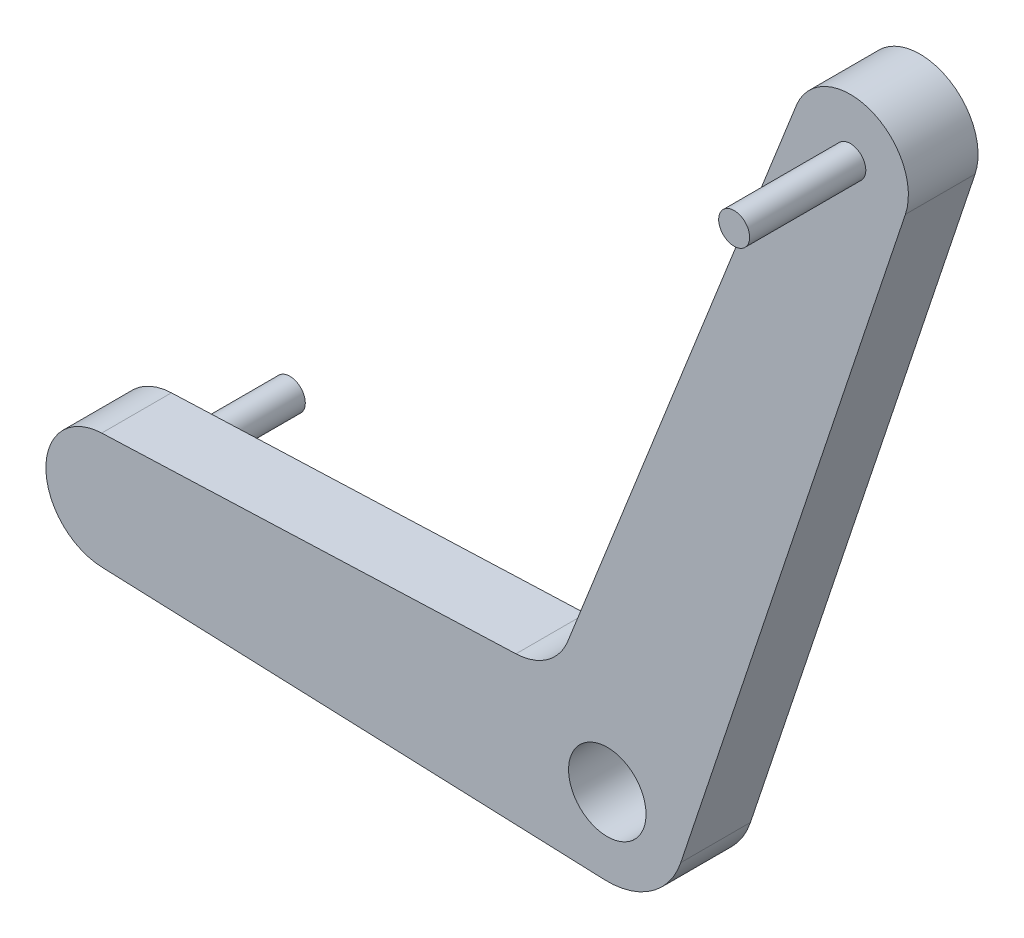
ISO-10303-21;
HEADER;
FILE_DESCRIPTION(('STEP AP214'),'2;1');
FILE_NAME('part.step','',(''),(''),'','','');
FILE_SCHEMA(('AUTOMOTIVE_DESIGN { 1 0 10303 214 1 1 1 1 }'));
ENDSEC;
DATA;
#1=APPLICATION_CONTEXT('core data for automotive mechanical design processes');
#2=APPLICATION_PROTOCOL_DEFINITION('international standard','automotive_design',2000,#1);
#3=PRODUCT_CONTEXT('',#1,'mechanical');
#4=PRODUCT('Part','Part','',(#3));
#5=PRODUCT_RELATED_PRODUCT_CATEGORY('part','',(#4));
#6=PRODUCT_DEFINITION_FORMATION('','',#4);
#7=PRODUCT_DEFINITION_CONTEXT('part definition',#1,'design');
#8=PRODUCT_DEFINITION('design','',#6,#7);
#9=PRODUCT_DEFINITION_SHAPE('','',#8);
#10=(LENGTH_UNIT() NAMED_UNIT(*) SI_UNIT(.MILLI.,.METRE.));
#11=(NAMED_UNIT(*) PLANE_ANGLE_UNIT() SI_UNIT($,.RADIAN.));
#12=(NAMED_UNIT(*) SI_UNIT($,.STERADIAN.) SOLID_ANGLE_UNIT());
#13=UNCERTAINTY_MEASURE_WITH_UNIT(LENGTH_MEASURE(1.E-05),#10,'distance_accuracy_value','');
#14=(GEOMETRIC_REPRESENTATION_CONTEXT(3) GLOBAL_UNCERTAINTY_ASSIGNED_CONTEXT((#13)) GLOBAL_UNIT_ASSIGNED_CONTEXT((#10,
#11,#12)) REPRESENTATION_CONTEXT('',''));
#15=CARTESIAN_POINT('',(0.,0.,0.));
#16=DIRECTION('',(0.,0.,1.));
#17=DIRECTION('',(1.,0.,0.));
#18=AXIS2_PLACEMENT_3D('',#15,#16,#17);
#19=CARTESIAN_POINT('',(-24.1604424859823,34.0959804659691,18.));
#20=DIRECTION('',(0.,0.,-1.));
#21=DIRECTION('',(-1.,0.,0.));
#22=AXIS2_PLACEMENT_3D('',#19,#20,#21);
#23=CYLINDRICAL_SURFACE('',#22,15.);
#24=CARTESIAN_POINT('',(-24.1604424859823,34.0959804659691,0.));
#25=DIRECTION('',(0.,0.,-1.));
#26=DIRECTION('',(-1.,0.,0.));
#27=AXIS2_PLACEMENT_3D('',#24,#25,#26);
#28=CIRCLE('',#27,15.);
#29=CARTESIAN_POINT('',(-10.2100769639498,28.5835126155697,0.));
#30=VERTEX_POINT('',#29);
#31=CARTESIAN_POINT('',(-23.5835194090593,19.1070792466231,0.));
#32=VERTEX_POINT('',#31);
#33=EDGE_CURVE('E147',#30,#32,#28,.T.);
#34=ORIENTED_EDGE('',*,*,#33,.T.);
#35=DIRECTION('',(0.,0.,-1.));
#36=VECTOR('',#35,1.);
#37=CARTESIAN_POINT('',(-23.5835194090593,19.1070792466231,18.));
#38=LINE('',#37,#36);
#39=CARTESIAN_POINT('',(-23.5835194090593,19.1070792466231,18.));
#40=VERTEX_POINT('',#39);
#41=EDGE_CURVE('E189',#40,#32,#38,.T.);
#42=ORIENTED_EDGE('',*,*,#41,.F.);
#43=CARTESIAN_POINT('',(-24.1604424859823,34.0959804659691,18.));
#44=DIRECTION('',(0.,0.,-1.));
#45=DIRECTION('',(-1.,0.,0.));
#46=AXIS2_PLACEMENT_3D('',#43,#44,#45);
#47=CIRCLE('',#46,15.);
#48=CARTESIAN_POINT('',(-10.2100769639498,28.5835126155697,18.));
#49=VERTEX_POINT('',#48);
#50=EDGE_CURVE('E170',#49,#40,#47,.T.);
#51=ORIENTED_EDGE('',*,*,#50,.F.);
#52=DIRECTION('',(0.,0.,-1.));
#53=VECTOR('',#52,1.);
#54=CARTESIAN_POINT('',(-10.2100769639498,28.5835126155697,18.));
#55=LINE('',#54,#53);
#56=EDGE_CURVE('E143',#49,#30,#55,.T.);
#57=ORIENTED_EDGE('',*,*,#56,.T.);
#58=EDGE_LOOP('',(#34,#42,#51,#57));
#59=FACE_BOUND('',#58,.T.);
#60=ADVANCED_FACE('F45',(#59),#23,.F.);
#61=CARTESIAN_POINT('',(-130.576923076923,14.9889012193461,18.));
#62=DIRECTION('',(0.0384615384615384,-0.999260081289737,0.));
#63=DIRECTION('',(0.999260081289737,0.0384615384615384,0.));
#64=AXIS2_PLACEMENT_3D('',#61,#62,#63);
#65=PLANE('',#64);
#66=DIRECTION('',(-0.999260081289737,-0.0384615384615384,0.));
#67=VECTOR('',#66,1.);
#68=CARTESIAN_POINT('',(-130.576923076923,14.9889012193461,0.));
#69=LINE('',#68,#67);
#70=CARTESIAN_POINT('',(-130.576923076923,14.9889012193461,0.));
#71=VERTEX_POINT('',#70);
#72=EDGE_CURVE('E151',#32,#71,#69,.T.);
#73=ORIENTED_EDGE('',*,*,#72,.T.);
#74=DIRECTION('',(0.,0.,-1.));
#75=VECTOR('',#74,1.);
#76=CARTESIAN_POINT('',(-130.576923076923,14.9889012193461,18.));
#77=LINE('',#76,#75);
#78=CARTESIAN_POINT('',(-130.576923076923,14.9889012193461,18.));
#79=VERTEX_POINT('',#78);
#80=EDGE_CURVE('E185',#79,#71,#77,.T.);
#81=ORIENTED_EDGE('',*,*,#80,.F.);
#82=DIRECTION('',(-0.999260081289737,-0.0384615384615384,0.));
#83=VECTOR('',#82,1.);
#84=CARTESIAN_POINT('',(-130.576923076923,14.9889012193461,18.));
#85=LINE('',#84,#83);
#86=EDGE_CURVE('E106',#40,#79,#85,.T.);
#87=ORIENTED_EDGE('',*,*,#86,.F.);
#88=ORIENTED_EDGE('',*,*,#41,.T.);
#89=EDGE_LOOP('',(#73,#81,#87,#88));
#90=FACE_BOUND('',#89,.T.);
#91=ADVANCED_FACE('F223',(#90),#65,.F.);
#92=CARTESIAN_POINT('',(-130.,0.,18.));
#93=DIRECTION('',(0.,0.,-1.));
#94=DIRECTION('',(-1.,0.,0.));
#95=AXIS2_PLACEMENT_3D('',#92,#93,#94);
#96=CYLINDRICAL_SURFACE('',#95,15.);
#97=CARTESIAN_POINT('',(-130.,0.,0.));
#98=DIRECTION('',(0.,0.,1.));
#99=DIRECTION('',(1.,0.,0.));
#100=AXIS2_PLACEMENT_3D('',#97,#98,#99);
#101=CIRCLE('',#100,15.);
#102=CARTESIAN_POINT('',(-130.576923076923,-14.9889012193461,0.));
#103=VERTEX_POINT('',#102);
#104=EDGE_CURVE('E155',#71,#103,#101,.T.);
#105=ORIENTED_EDGE('',*,*,#104,.T.);
#106=DIRECTION('',(0.,0.,-1.));
#107=VECTOR('',#106,1.);
#108=CARTESIAN_POINT('',(-130.576923076923,-14.9889012193461,18.));
#109=LINE('',#108,#107);
#110=CARTESIAN_POINT('',(-130.576923076923,-14.9889012193461,18.));
#111=VERTEX_POINT('',#110);
#112=EDGE_CURVE('E181',#111,#103,#109,.T.);
#113=ORIENTED_EDGE('',*,*,#112,.F.);
#114=CARTESIAN_POINT('',(-130.,0.,18.));
#115=DIRECTION('',(0.,0.,1.));
#116=DIRECTION('',(1.,0.,0.));
#117=AXIS2_PLACEMENT_3D('',#114,#115,#116);
#118=CIRCLE('',#117,15.);
#119=EDGE_CURVE('E338',#79,#111,#118,.T.);
#120=ORIENTED_EDGE('',*,*,#119,.F.);
#121=ORIENTED_EDGE('',*,*,#80,.T.);
#122=EDGE_LOOP('',(#105,#113,#120,#121));
#123=FACE_BOUND('',#122,.T.);
#124=ADVANCED_FACE('F227',(#123),#96,.T.);
#125=CARTESIAN_POINT('',(-0.769230769230769,-19.9852016257947,18.));
#126=DIRECTION('',(0.0384615384615385,0.999260081289737,0.));
#127=DIRECTION('',(-0.999260081289737,0.0384615384615385,0.));
#128=AXIS2_PLACEMENT_3D('',#125,#126,#127);
#129=PLANE('',#128);
#130=DIRECTION('',(0.999260081289737,-0.0384615384615385,0.));
#131=VECTOR('',#130,1.);
#132=CARTESIAN_POINT('',(-0.769230769230769,-19.9852016257947,0.));
#133=LINE('',#132,#131);
#134=CARTESIAN_POINT('',(-0.769230769230773,-19.9852016257947,0.));
#135=VERTEX_POINT('',#134);
#136=EDGE_CURVE('E158',#103,#135,#133,.T.);
#137=ORIENTED_EDGE('',*,*,#136,.T.);
#138=DIRECTION('',(0.,0.,-1.));
#139=VECTOR('',#138,1.);
#140=CARTESIAN_POINT('',(-0.769230769230773,-19.9852016257947,18.));
#141=LINE('',#140,#139);
#142=CARTESIAN_POINT('',(-0.769230769230773,-19.9852016257947,18.));
#143=VERTEX_POINT('',#142);
#144=EDGE_CURVE('E177',#143,#135,#141,.T.);
#145=ORIENTED_EDGE('',*,*,#144,.F.);
#146=DIRECTION('',(0.999260081289737,-0.0384615384615385,0.));
#147=VECTOR('',#146,1.);
#148=CARTESIAN_POINT('',(-0.769230769230769,-19.9852016257947,18.));
#149=LINE('',#148,#147);
#150=EDGE_CURVE('E341',#111,#143,#149,.T.);
#151=ORIENTED_EDGE('',*,*,#150,.F.);
#152=ORIENTED_EDGE('',*,*,#112,.T.);
#153=EDGE_LOOP('',(#137,#145,#151,#152));
#154=FACE_BOUND('',#153,.T.);
#155=ADVANCED_FACE('F231',(#154),#129,.F.);
#156=CARTESIAN_POINT('',(0.,0.,18.));
#157=DIRECTION('',(0.,0.,-1.));
#158=DIRECTION('',(-1.,0.,0.));
#159=AXIS2_PLACEMENT_3D('',#156,#157,#158);
#160=CYLINDRICAL_SURFACE('',#159,20.);
#161=CARTESIAN_POINT('',(0.,0.,0.));
#162=DIRECTION('',(0.,0.,1.));
#163=DIRECTION('',(1.,0.,0.));
#164=AXIS2_PLACEMENT_3D('',#161,#162,#163);
#165=CIRCLE('',#164,20.);
#166=CARTESIAN_POINT('',(18.973261360885,-6.3257689913201,0.));
#167=VERTEX_POINT('',#166);
#168=EDGE_CURVE('E161',#135,#167,#165,.T.);
#169=ORIENTED_EDGE('',*,*,#168,.T.);
#170=DIRECTION('',(0.,0.,-1.));
#171=VECTOR('',#170,1.);
#172=CARTESIAN_POINT('',(18.973261360885,-6.3257689913201,18.));
#173=LINE('',#172,#171);
#174=CARTESIAN_POINT('',(18.973261360885,-6.3257689913201,18.));
#175=VERTEX_POINT('',#174);
#176=EDGE_CURVE('E136',#175,#167,#173,.T.);
#177=ORIENTED_EDGE('',*,*,#176,.F.);
#178=CARTESIAN_POINT('',(0.,0.,18.));
#179=DIRECTION('',(0.,0.,1.));
#180=DIRECTION('',(1.,0.,0.));
#181=AXIS2_PLACEMENT_3D('',#178,#179,#180);
#182=CIRCLE('',#181,20.);
#183=EDGE_CURVE('E125',#143,#175,#182,.T.);
#184=ORIENTED_EDGE('',*,*,#183,.F.);
#185=ORIENTED_EDGE('',*,*,#144,.T.);
#186=EDGE_LOOP('',(#169,#177,#184,#185));
#187=FACE_BOUND('',#186,.T.);
#188=ADVANCED_FACE('F237',(#187),#160,.T.);
#189=CARTESIAN_POINT('',(18.973261360885,-6.3257689913201,18.));
#190=DIRECTION('',(-0.948663068044252,0.316288449566005,0.));
#191=DIRECTION('',(-0.316288449566005,-0.948663068044252,0.));
#192=AXIS2_PLACEMENT_3D('',#189,#190,#191);
#193=PLANE('',#192);
#194=DIRECTION('',(0.316288449566005,0.948663068044252,0.));
#195=VECTOR('',#194,1.);
#196=CARTESIAN_POINT('',(18.973261360885,-6.3257689913201,0.));
#197=LINE('',#196,#195);
#198=CARTESIAN_POINT('',(76.9906423209235,167.689269170724,0.));
#199=VERTEX_POINT('',#198);
#200=EDGE_CURVE('E134',#167,#199,#197,.T.);
#201=ORIENTED_EDGE('',*,*,#200,.T.);
#202=DIRECTION('',(0.,0.,-1.));
#203=VECTOR('',#202,1.);
#204=CARTESIAN_POINT('',(76.9906423209235,167.689269170724,18.));
#205=LINE('',#204,#203);
#206=CARTESIAN_POINT('',(76.9906423209235,167.689269170724,18.));
#207=VERTEX_POINT('',#206);
#208=EDGE_CURVE('E131',#207,#199,#205,.T.);
#209=ORIENTED_EDGE('',*,*,#208,.F.);
#210=DIRECTION('',(0.316288449566005,0.948663068044252,0.));
#211=VECTOR('',#210,1.);
#212=CARTESIAN_POINT('',(18.973261360885,-6.3257689913201,18.));
#213=LINE('',#212,#211);
#214=EDGE_CURVE('E119',#175,#207,#213,.T.);
#215=ORIENTED_EDGE('',*,*,#214,.F.);
#216=ORIENTED_EDGE('',*,*,#176,.T.);
#217=EDGE_LOOP('',(#201,#209,#215,#216));
#218=FACE_BOUND('',#217,.T.);
#219=ADVANCED_FACE('F132',(#218),#193,.F.);
#220=CARTESIAN_POINT('',(62.7606963002597,172.433595914214,18.));
#221=DIRECTION('',(0.,0.,-1.));
#222=DIRECTION('',(-1.,0.,0.));
#223=AXIS2_PLACEMENT_3D('',#220,#221,#222);
#224=CYLINDRICAL_SURFACE('',#223,15.);
#225=CARTESIAN_POINT('',(62.7606963002597,172.433595914214,0.));
#226=DIRECTION('',(0.,0.,1.));
#227=DIRECTION('',(1.,0.,0.));
#228=AXIS2_PLACEMENT_3D('',#225,#226,#227);
#229=CIRCLE('',#228,15.);
#230=CARTESIAN_POINT('',(48.8103307782272,177.946063764614,0.));
#231=VERTEX_POINT('',#230);
#232=EDGE_CURVE('E91',#199,#231,#229,.T.);
#233=ORIENTED_EDGE('',*,*,#232,.T.);
#234=DIRECTION('',(0.,0.,-1.));
#235=VECTOR('',#234,1.);
#236=CARTESIAN_POINT('',(48.8103307782272,177.946063764614,18.));
#237=LINE('',#236,#235);
#238=CARTESIAN_POINT('',(48.8103307782272,177.946063764614,18.));
#239=VERTEX_POINT('',#238);
#240=EDGE_CURVE('E137',#239,#231,#237,.T.);
#241=ORIENTED_EDGE('',*,*,#240,.F.);
#242=CARTESIAN_POINT('',(62.7606963002597,172.433595914214,18.));
#243=DIRECTION('',(0.,0.,1.));
#244=DIRECTION('',(1.,0.,0.));
#245=AXIS2_PLACEMENT_3D('',#242,#243,#244);
#246=CIRCLE('',#245,15.);
#247=EDGE_CURVE('E123',#207,#239,#246,.T.);
#248=ORIENTED_EDGE('',*,*,#247,.F.);
#249=ORIENTED_EDGE('',*,*,#208,.T.);
#250=EDGE_LOOP('',(#233,#241,#248,#249));
#251=FACE_BOUND('',#250,.T.);
#252=ADVANCED_FACE('F139',(#251),#224,.T.);
#253=CARTESIAN_POINT('',(48.8103307782272,177.946063764614,18.));
#254=DIRECTION('',(0.930024368135496,-0.367497856693302,0.));
#255=DIRECTION('',(0.367497856693302,0.930024368135496,0.));
#256=AXIS2_PLACEMENT_3D('',#253,#254,#255);
#257=PLANE('',#256);
#258=DIRECTION('',(-0.367497856693302,-0.930024368135496,0.));
#259=VECTOR('',#258,1.);
#260=CARTESIAN_POINT('',(48.8103307782272,177.946063764614,0.));
#261=LINE('',#260,#259);
#262=EDGE_CURVE('E97',#231,#30,#261,.T.);
#263=ORIENTED_EDGE('',*,*,#262,.T.);
#264=ORIENTED_EDGE('',*,*,#56,.F.);
#265=DIRECTION('',(-0.367497856693302,-0.930024368135496,0.));
#266=VECTOR('',#265,1.);
#267=CARTESIAN_POINT('',(48.8103307782272,177.946063764614,18.));
#268=LINE('',#267,#266);
#269=EDGE_CURVE('E62',#239,#49,#268,.T.);
#270=ORIENTED_EDGE('',*,*,#269,.F.);
#271=ORIENTED_EDGE('',*,*,#240,.T.);
#272=EDGE_LOOP('',(#263,#264,#270,#271));
#273=FACE_BOUND('',#272,.T.);
#274=ADVANCED_FACE('F211',(#273),#257,.F.);
#275=CARTESIAN_POINT('',(-24.1604424859823,34.0959804659691,18.));
#276=DIRECTION('',(0.,0.,-1.));
#277=DIRECTION('',(-1.,0.,0.));
#278=AXIS2_PLACEMENT_3D('',#275,#276,#277);
#279=PLANE('',#278);
#280=CARTESIAN_POINT('',(62.7606963002597,172.433595914214,18.));
#281=DIRECTION('',(0.,0.,-1.));
#282=DIRECTION('',(-1.,0.,0.));
#283=AXIS2_PLACEMENT_3D('',#280,#281,#282);
#284=CIRCLE('',#283,4.00000000000001);
#285=CARTESIAN_POINT('',(58.7606963002597,172.433595914214,18.));
#286=VERTEX_POINT('',#285);
#287=EDGE_CURVE('E11',#286,#286,#284,.F.);
#288=ORIENTED_EDGE('',*,*,#287,.F.);
#289=EDGE_LOOP('',(#288));
#290=FACE_BOUND('',#289,.T.);
#291=CARTESIAN_POINT('',(0.,0.,18.));
#292=DIRECTION('',(0.,0.,1.));
#293=DIRECTION('',(1.,0.,0.));
#294=AXIS2_PLACEMENT_3D('',#291,#292,#293);
#295=CIRCLE('',#294,10.);
#296=CARTESIAN_POINT('',(10.,0.,18.));
#297=VERTEX_POINT('',#296);
#298=EDGE_CURVE('E152',#297,#297,#295,.T.);
#299=ORIENTED_EDGE('',*,*,#298,.F.);
#300=EDGE_LOOP('',(#299));
#301=FACE_BOUND('',#300,.T.);
#302=ORIENTED_EDGE('',*,*,#50,.T.);
#303=ORIENTED_EDGE('',*,*,#86,.T.);
#304=ORIENTED_EDGE('',*,*,#119,.T.);
#305=ORIENTED_EDGE('',*,*,#150,.T.);
#306=ORIENTED_EDGE('',*,*,#183,.T.);
#307=ORIENTED_EDGE('',*,*,#214,.T.);
#308=ORIENTED_EDGE('',*,*,#247,.T.);
#309=ORIENTED_EDGE('',*,*,#269,.T.);
#310=EDGE_LOOP('',(#302,#303,#304,#305,#306,#307,#308,#309));
#311=FACE_BOUND('',#310,.T.);
#312=ADVANCED_FACE('F121',(#290,#301,#311),#279,.F.);
#313=CARTESIAN_POINT('',(-24.1604424859823,34.0959804659691,0.));
#314=DIRECTION('',(0.,0.,-1.));
#315=DIRECTION('',(-1.,0.,0.));
#316=AXIS2_PLACEMENT_3D('',#313,#314,#315);
#317=PLANE('',#316);
#318=CARTESIAN_POINT('',(-130.,0.,0.));
#319=DIRECTION('',(0.,0.,-1.));
#320=DIRECTION('',(-1.,0.,0.));
#321=AXIS2_PLACEMENT_3D('',#318,#319,#320);
#322=CIRCLE('',#321,3.99999999999999);
#323=CARTESIAN_POINT('',(-134.,0.,0.));
#324=VERTEX_POINT('',#323);
#325=EDGE_CURVE('E54',#324,#324,#322,.T.);
#326=ORIENTED_EDGE('',*,*,#325,.F.);
#327=EDGE_LOOP('',(#326));
#328=FACE_BOUND('',#327,.T.);
#329=CARTESIAN_POINT('',(0.,0.,0.));
#330=DIRECTION('',(0.,0.,1.));
#331=DIRECTION('',(1.,0.,0.));
#332=AXIS2_PLACEMENT_3D('',#329,#330,#331);
#333=CIRCLE('',#332,10.);
#334=CARTESIAN_POINT('',(10.,0.,0.));
#335=VERTEX_POINT('',#334);
#336=EDGE_CURVE('E205',#335,#335,#333,.T.);
#337=ORIENTED_EDGE('',*,*,#336,.T.);
#338=EDGE_LOOP('',(#337));
#339=FACE_BOUND('',#338,.T.);
#340=ORIENTED_EDGE('',*,*,#33,.F.);
#341=ORIENTED_EDGE('',*,*,#262,.F.);
#342=ORIENTED_EDGE('',*,*,#232,.F.);
#343=ORIENTED_EDGE('',*,*,#200,.F.);
#344=ORIENTED_EDGE('',*,*,#168,.F.);
#345=ORIENTED_EDGE('',*,*,#136,.F.);
#346=ORIENTED_EDGE('',*,*,#104,.F.);
#347=ORIENTED_EDGE('',*,*,#72,.F.);
#348=EDGE_LOOP('',(#340,#341,#342,#343,#344,#345,#346,#347));
#349=FACE_BOUND('',#348,.T.);
#350=ADVANCED_FACE('F197',(#328,#339,#349),#317,.T.);
#351=CARTESIAN_POINT('',(0.,0.,18.));
#352=DIRECTION('',(0.,0.,-1.));
#353=DIRECTION('',(-1.,0.,0.));
#354=AXIS2_PLACEMENT_3D('',#351,#352,#353);
#355=CYLINDRICAL_SURFACE('',#354,10.);
#356=ORIENTED_EDGE('',*,*,#298,.T.);
#357=EDGE_LOOP('',(#356));
#358=FACE_BOUND('',#357,.T.);
#359=ORIENTED_EDGE('',*,*,#336,.F.);
#360=EDGE_LOOP('',(#359));
#361=FACE_BOUND('',#360,.T.);
#362=ADVANCED_FACE('F200',(#358,#361),#355,.F.);
#363=CARTESIAN_POINT('',(-130.,0.,-30.));
#364=DIRECTION('',(0.,0.,1.));
#365=DIRECTION('',(1.,0.,0.));
#366=AXIS2_PLACEMENT_3D('',#363,#364,#365);
#367=CYLINDRICAL_SURFACE('',#366,3.99999999999999);
#368=CARTESIAN_POINT('',(-130.,0.,-30.));
#369=DIRECTION('',(0.,0.,1.));
#370=DIRECTION('',(1.,0.,0.));
#371=AXIS2_PLACEMENT_3D('',#368,#369,#370);
#372=CIRCLE('',#371,3.99999999999999);
#373=CARTESIAN_POINT('',(-126.,0.,-30.));
#374=VERTEX_POINT('',#373);
#375=EDGE_CURVE('E323',#374,#374,#372,.T.);
#376=ORIENTED_EDGE('',*,*,#375,.T.);
#377=EDGE_LOOP('',(#376));
#378=FACE_BOUND('',#377,.T.);
#379=ORIENTED_EDGE('',*,*,#325,.T.);
#380=EDGE_LOOP('',(#379));
#381=FACE_BOUND('',#380,.T.);
#382=ADVANCED_FACE('F195',(#378,#381),#367,.T.);
#383=CARTESIAN_POINT('',(-130.,0.,-30.));
#384=DIRECTION('',(0.,0.,1.));
#385=DIRECTION('',(1.,0.,0.));
#386=AXIS2_PLACEMENT_3D('',#383,#384,#385);
#387=PLANE('',#386);
#388=ORIENTED_EDGE('',*,*,#375,.F.);
#389=EDGE_LOOP('',(#388));
#390=FACE_BOUND('',#389,.T.);
#391=ADVANCED_FACE('F288',(#390),#387,.F.);
#392=CARTESIAN_POINT('',(62.7606963002597,172.433595914214,48.));
#393=DIRECTION('',(0.,0.,-1.));
#394=DIRECTION('',(-1.,0.,0.));
#395=AXIS2_PLACEMENT_3D('',#392,#393,#394);
#396=CYLINDRICAL_SURFACE('',#395,4.00000000000001);
#397=CARTESIAN_POINT('',(62.7606963002597,172.433595914214,48.));
#398=DIRECTION('',(0.,0.,1.));
#399=DIRECTION('',(1.,0.,0.));
#400=AXIS2_PLACEMENT_3D('',#397,#398,#399);
#401=CIRCLE('',#400,4.00000000000001);
#402=CARTESIAN_POINT('',(66.7606963002597,172.433595914214,48.));
#403=VERTEX_POINT('',#402);
#404=EDGE_CURVE('E321',#403,#403,#401,.T.);
#405=ORIENTED_EDGE('',*,*,#404,.F.);
#406=EDGE_LOOP('',(#405));
#407=FACE_BOUND('',#406,.T.);
#408=ORIENTED_EDGE('',*,*,#287,.T.);
#409=EDGE_LOOP('',(#408));
#410=FACE_BOUND('',#409,.T.);
#411=ADVANCED_FACE('F297',(#407,#410),#396,.T.);
#412=CARTESIAN_POINT('',(62.7606963002597,172.433595914214,48.));
#413=DIRECTION('',(0.,0.,1.));
#414=DIRECTION('',(1.,0.,0.));
#415=AXIS2_PLACEMENT_3D('',#412,#413,#414);
#416=PLANE('',#415);
#417=ORIENTED_EDGE('',*,*,#404,.T.);
#418=EDGE_LOOP('',(#417));
#419=FACE_BOUND('',#418,.T.);
#420=ADVANCED_FACE('F306',(#419),#416,.T.);
#421=CLOSED_SHELL('',(#60,#91,#124,#155,#188,#219,#252,#274,#312,#350,#362,#382,#391,#411,#420));
#422=MANIFOLD_SOLID_BREP('B2',#421);
#423=ADVANCED_BREP_SHAPE_REPRESENTATION('',(#18,#422),#14);
#424=SHAPE_DEFINITION_REPRESENTATION(#9,#423);
ENDSEC;
END-ISO-10303-21;
